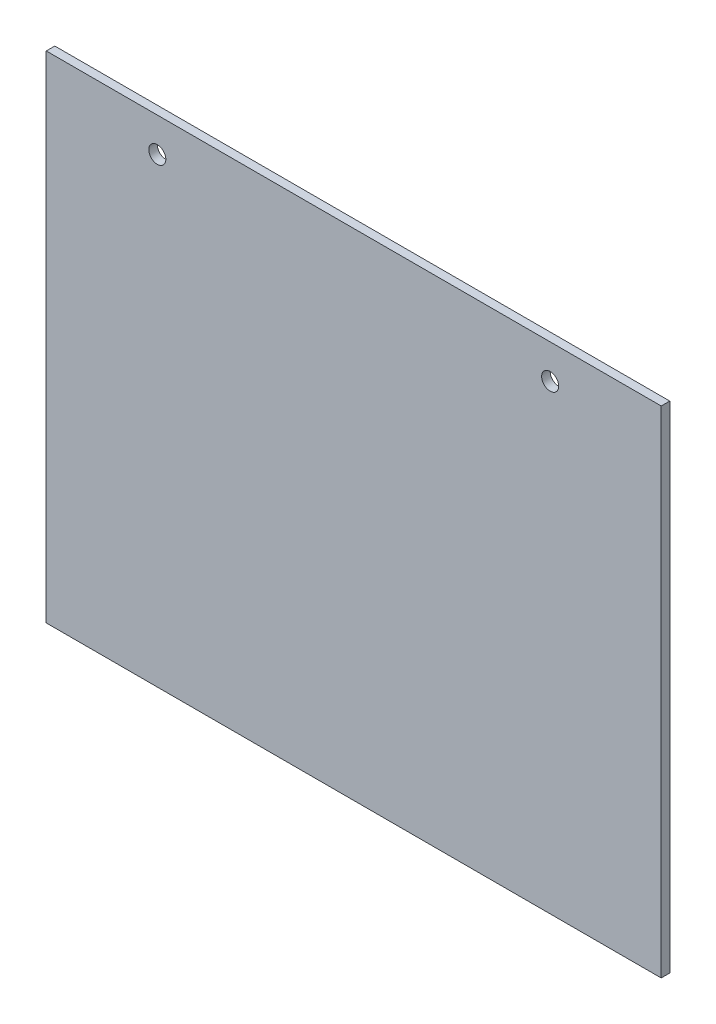
ISO-10303-21;
HEADER;
FILE_DESCRIPTION(('STEP AP214'),'2;1');
FILE_NAME('part.step','',(''),(''),'','','');
FILE_SCHEMA(('AUTOMOTIVE_DESIGN { 1 0 10303 214 1 1 1 1 }'));
ENDSEC;
DATA;
#1=APPLICATION_CONTEXT('core data for automotive mechanical design processes');
#2=APPLICATION_PROTOCOL_DEFINITION('international standard','automotive_design',2000,#1);
#3=PRODUCT_CONTEXT('',#1,'mechanical');
#4=PRODUCT('Part','Part','',(#3));
#5=PRODUCT_RELATED_PRODUCT_CATEGORY('part','',(#4));
#6=PRODUCT_DEFINITION_FORMATION('','',#4);
#7=PRODUCT_DEFINITION_CONTEXT('part definition',#1,'design');
#8=PRODUCT_DEFINITION('design','',#6,#7);
#9=PRODUCT_DEFINITION_SHAPE('','',#8);
#10=(LENGTH_UNIT() NAMED_UNIT(*) SI_UNIT(.MILLI.,.METRE.));
#11=(NAMED_UNIT(*) PLANE_ANGLE_UNIT() SI_UNIT($,.RADIAN.));
#12=(NAMED_UNIT(*) SI_UNIT($,.STERADIAN.) SOLID_ANGLE_UNIT());
#13=UNCERTAINTY_MEASURE_WITH_UNIT(LENGTH_MEASURE(1.E-05),#10,'distance_accuracy_value','');
#14=(GEOMETRIC_REPRESENTATION_CONTEXT(3) GLOBAL_UNCERTAINTY_ASSIGNED_CONTEXT((#13)) GLOBAL_UNIT_ASSIGNED_CONTEXT((#10,
#11,#12)) REPRESENTATION_CONTEXT('',''));
#15=CARTESIAN_POINT('',(0.,0.,0.));
#16=DIRECTION('',(0.,0.,1.));
#17=DIRECTION('',(1.,0.,0.));
#18=AXIS2_PLACEMENT_3D('',#15,#16,#17);
#19=CARTESIAN_POINT('',(0.,0.,5.));
#20=DIRECTION('',(1.,0.,0.));
#21=DIRECTION('',(0.,0.,-1.));
#22=AXIS2_PLACEMENT_3D('',#19,#20,#21);
#23=PLANE('',#22);
#24=DIRECTION('',(0.,-1.,0.));
#25=VECTOR('',#24,1.);
#26=CARTESIAN_POINT('',(0.,0.,0.));
#27=LINE('',#26,#25);
#28=CARTESIAN_POINT('',(0.,290.,0.));
#29=VERTEX_POINT('',#28);
#30=CARTESIAN_POINT('',(0.,0.,0.));
#31=VERTEX_POINT('',#30);
#32=EDGE_CURVE('E106',#29,#31,#27,.T.);
#33=ORIENTED_EDGE('',*,*,#32,.T.);
#34=DIRECTION('',(0.,0.,-1.));
#35=VECTOR('',#34,1.);
#36=CARTESIAN_POINT('',(0.,0.,5.));
#37=LINE('',#36,#35);
#38=CARTESIAN_POINT('',(0.,0.,5.));
#39=VERTEX_POINT('',#38);
#40=EDGE_CURVE('E11',#39,#31,#37,.T.);
#41=ORIENTED_EDGE('',*,*,#40,.F.);
#42=DIRECTION('',(0.,-1.,0.));
#43=VECTOR('',#42,1.);
#44=CARTESIAN_POINT('',(0.,0.,5.));
#45=LINE('',#44,#43);
#46=CARTESIAN_POINT('',(0.,290.,5.));
#47=VERTEX_POINT('',#46);
#48=EDGE_CURVE('E90',#47,#39,#45,.T.);
#49=ORIENTED_EDGE('',*,*,#48,.F.);
#50=DIRECTION('',(0.,0.,-1.));
#51=VECTOR('',#50,1.);
#52=CARTESIAN_POINT('',(0.,290.,5.));
#53=LINE('',#52,#51);
#54=EDGE_CURVE('E102',#47,#29,#53,.T.);
#55=ORIENTED_EDGE('',*,*,#54,.T.);
#56=EDGE_LOOP('',(#33,#41,#49,#55));
#57=FACE_BOUND('',#56,.T.);
#58=ADVANCED_FACE('F38',(#57),#23,.F.);
#59=CARTESIAN_POINT('',(0.,0.,5.));
#60=DIRECTION('',(0.,1.,0.));
#61=DIRECTION('',(0.,0.,1.));
#62=AXIS2_PLACEMENT_3D('',#59,#60,#61);
#63=PLANE('',#62);
#64=DIRECTION('',(1.,0.,0.));
#65=VECTOR('',#64,1.);
#66=CARTESIAN_POINT('',(0.,0.,0.));
#67=LINE('',#66,#65);
#68=CARTESIAN_POINT('',(360.,0.,0.));
#69=VERTEX_POINT('',#68);
#70=EDGE_CURVE('E95',#31,#69,#67,.T.);
#71=ORIENTED_EDGE('',*,*,#70,.T.);
#72=DIRECTION('',(0.,0.,-1.));
#73=VECTOR('',#72,1.);
#74=CARTESIAN_POINT('',(360.,0.,5.));
#75=LINE('',#74,#73);
#76=CARTESIAN_POINT('',(360.,0.,5.));
#77=VERTEX_POINT('',#76);
#78=EDGE_CURVE('E47',#77,#69,#75,.T.);
#79=ORIENTED_EDGE('',*,*,#78,.F.);
#80=DIRECTION('',(1.,0.,0.));
#81=VECTOR('',#80,1.);
#82=CARTESIAN_POINT('',(0.,0.,5.));
#83=LINE('',#82,#81);
#84=EDGE_CURVE('E85',#39,#77,#83,.T.);
#85=ORIENTED_EDGE('',*,*,#84,.F.);
#86=ORIENTED_EDGE('',*,*,#40,.T.);
#87=EDGE_LOOP('',(#71,#79,#85,#86));
#88=FACE_BOUND('',#87,.T.);
#89=ADVANCED_FACE('F94',(#88),#63,.F.);
#90=CARTESIAN_POINT('',(360.,0.,5.));
#91=DIRECTION('',(-1.,0.,0.));
#92=DIRECTION('',(0.,0.,1.));
#93=AXIS2_PLACEMENT_3D('',#90,#91,#92);
#94=PLANE('',#93);
#95=DIRECTION('',(0.,1.,0.));
#96=VECTOR('',#95,1.);
#97=CARTESIAN_POINT('',(360.,0.,0.));
#98=LINE('',#97,#96);
#99=CARTESIAN_POINT('',(360.,290.,0.));
#100=VERTEX_POINT('',#99);
#101=EDGE_CURVE('E72',#69,#100,#98,.T.);
#102=ORIENTED_EDGE('',*,*,#101,.T.);
#103=DIRECTION('',(0.,0.,-1.));
#104=VECTOR('',#103,1.);
#105=CARTESIAN_POINT('',(360.,290.,5.));
#106=LINE('',#105,#104);
#107=CARTESIAN_POINT('',(360.,290.,5.));
#108=VERTEX_POINT('',#107);
#109=EDGE_CURVE('E97',#108,#100,#106,.T.);
#110=ORIENTED_EDGE('',*,*,#109,.F.);
#111=DIRECTION('',(0.,1.,0.));
#112=VECTOR('',#111,1.);
#113=CARTESIAN_POINT('',(360.,0.,5.));
#114=LINE('',#113,#112);
#115=EDGE_CURVE('E88',#77,#108,#114,.T.);
#116=ORIENTED_EDGE('',*,*,#115,.F.);
#117=ORIENTED_EDGE('',*,*,#78,.T.);
#118=EDGE_LOOP('',(#102,#110,#116,#117));
#119=FACE_BOUND('',#118,.T.);
#120=ADVANCED_FACE('F98',(#119),#94,.F.);
#121=CARTESIAN_POINT('',(0.,290.,5.));
#122=DIRECTION('',(0.,-1.,0.));
#123=DIRECTION('',(0.,0.,-1.));
#124=AXIS2_PLACEMENT_3D('',#121,#122,#123);
#125=PLANE('',#124);
#126=DIRECTION('',(-1.,0.,0.));
#127=VECTOR('',#126,1.);
#128=CARTESIAN_POINT('',(0.,290.,0.));
#129=LINE('',#128,#127);
#130=EDGE_CURVE('E78',#100,#29,#129,.T.);
#131=ORIENTED_EDGE('',*,*,#130,.T.);
#132=ORIENTED_EDGE('',*,*,#54,.F.);
#133=DIRECTION('',(-1.,0.,0.));
#134=VECTOR('',#133,1.);
#135=CARTESIAN_POINT('',(0.,290.,5.));
#136=LINE('',#135,#134);
#137=EDGE_CURVE('E55',#108,#47,#136,.T.);
#138=ORIENTED_EDGE('',*,*,#137,.F.);
#139=ORIENTED_EDGE('',*,*,#109,.T.);
#140=EDGE_LOOP('',(#131,#132,#138,#139));
#141=FACE_BOUND('',#140,.T.);
#142=ADVANCED_FACE('F120',(#141),#125,.F.);
#143=CARTESIAN_POINT('',(0.,0.,5.));
#144=DIRECTION('',(0.,0.,-1.));
#145=DIRECTION('',(-1.,0.,0.));
#146=AXIS2_PLACEMENT_3D('',#143,#144,#145);
#147=PLANE('',#146);
#148=CARTESIAN_POINT('',(65.,270.,5.));
#149=DIRECTION('',(0.,0.,1.));
#150=DIRECTION('',(1.,0.,0.));
#151=AXIS2_PLACEMENT_3D('',#148,#149,#150);
#152=CIRCLE('',#151,5.00000000000001);
#153=CARTESIAN_POINT('',(70.,270.,5.));
#154=VERTEX_POINT('',#153);
#155=EDGE_CURVE('E135',#154,#154,#152,.T.);
#156=ORIENTED_EDGE('',*,*,#155,.F.);
#157=EDGE_LOOP('',(#156));
#158=FACE_BOUND('',#157,.T.);
#159=CARTESIAN_POINT('',(295.,270.,5.));
#160=DIRECTION('',(0.,0.,1.));
#161=DIRECTION('',(1.,0.,0.));
#162=AXIS2_PLACEMENT_3D('',#159,#160,#161);
#163=CIRCLE('',#162,4.99999999999999);
#164=CARTESIAN_POINT('',(300.,270.,5.));
#165=VERTEX_POINT('',#164);
#166=EDGE_CURVE('E127',#165,#165,#163,.T.);
#167=ORIENTED_EDGE('',*,*,#166,.F.);
#168=EDGE_LOOP('',(#167));
#169=FACE_BOUND('',#168,.T.);
#170=ORIENTED_EDGE('',*,*,#48,.T.);
#171=ORIENTED_EDGE('',*,*,#84,.T.);
#172=ORIENTED_EDGE('',*,*,#115,.T.);
#173=ORIENTED_EDGE('',*,*,#137,.T.);
#174=EDGE_LOOP('',(#170,#171,#172,#173));
#175=FACE_BOUND('',#174,.T.);
#176=ADVANCED_FACE('F86',(#158,#169,#175),#147,.F.);
#177=CARTESIAN_POINT('',(0.,0.,0.));
#178=DIRECTION('',(0.,0.,-1.));
#179=DIRECTION('',(-1.,0.,0.));
#180=AXIS2_PLACEMENT_3D('',#177,#178,#179);
#181=PLANE('',#180);
#182=CARTESIAN_POINT('',(65.,270.,0.));
#183=DIRECTION('',(0.,0.,1.));
#184=DIRECTION('',(1.,0.,0.));
#185=AXIS2_PLACEMENT_3D('',#182,#183,#184);
#186=CIRCLE('',#185,5.00000000000001);
#187=CARTESIAN_POINT('',(70.,270.,0.));
#188=VERTEX_POINT('',#187);
#189=EDGE_CURVE('E110',#188,#188,#186,.T.);
#190=ORIENTED_EDGE('',*,*,#189,.T.);
#191=EDGE_LOOP('',(#190));
#192=FACE_BOUND('',#191,.T.);
#193=CARTESIAN_POINT('',(295.,270.,0.));
#194=DIRECTION('',(0.,0.,1.));
#195=DIRECTION('',(1.,0.,0.));
#196=AXIS2_PLACEMENT_3D('',#193,#194,#195);
#197=CIRCLE('',#196,4.99999999999999);
#198=CARTESIAN_POINT('',(300.,270.,0.));
#199=VERTEX_POINT('',#198);
#200=EDGE_CURVE('E131',#199,#199,#197,.T.);
#201=ORIENTED_EDGE('',*,*,#200,.T.);
#202=EDGE_LOOP('',(#201));
#203=FACE_BOUND('',#202,.T.);
#204=ORIENTED_EDGE('',*,*,#32,.F.);
#205=ORIENTED_EDGE('',*,*,#130,.F.);
#206=ORIENTED_EDGE('',*,*,#101,.F.);
#207=ORIENTED_EDGE('',*,*,#70,.F.);
#208=EDGE_LOOP('',(#204,#205,#206,#207));
#209=FACE_BOUND('',#208,.T.);
#210=ADVANCED_FACE('F123',(#192,#203,#209),#181,.T.);
#211=CARTESIAN_POINT('',(295.,270.,0.));
#212=DIRECTION('',(0.,0.,1.));
#213=DIRECTION('',(1.,0.,0.));
#214=AXIS2_PLACEMENT_3D('',#211,#212,#213);
#215=CYLINDRICAL_SURFACE('',#214,4.99999999999999);
#216=ORIENTED_EDGE('',*,*,#200,.F.);
#217=EDGE_LOOP('',(#216));
#218=FACE_BOUND('',#217,.T.);
#219=ORIENTED_EDGE('',*,*,#166,.T.);
#220=EDGE_LOOP('',(#219));
#221=FACE_BOUND('',#220,.T.);
#222=ADVANCED_FACE('F148',(#218,#221),#215,.F.);
#223=CARTESIAN_POINT('',(65.,270.,0.));
#224=DIRECTION('',(0.,0.,1.));
#225=DIRECTION('',(1.,0.,0.));
#226=AXIS2_PLACEMENT_3D('',#223,#224,#225);
#227=CYLINDRICAL_SURFACE('',#226,5.00000000000001);
#228=ORIENTED_EDGE('',*,*,#189,.F.);
#229=EDGE_LOOP('',(#228));
#230=FACE_BOUND('',#229,.T.);
#231=ORIENTED_EDGE('',*,*,#155,.T.);
#232=EDGE_LOOP('',(#231));
#233=FACE_BOUND('',#232,.T.);
#234=ADVANCED_FACE('F145',(#230,#233),#227,.F.);
#235=CLOSED_SHELL('',(#58,#89,#120,#142,#176,#210,#222,#234));
#236=MANIFOLD_SOLID_BREP('B2',#235);
#237=ADVANCED_BREP_SHAPE_REPRESENTATION('',(#18,#236),#14);
#238=SHAPE_DEFINITION_REPRESENTATION(#9,#237);
ENDSEC;
END-ISO-10303-21;
